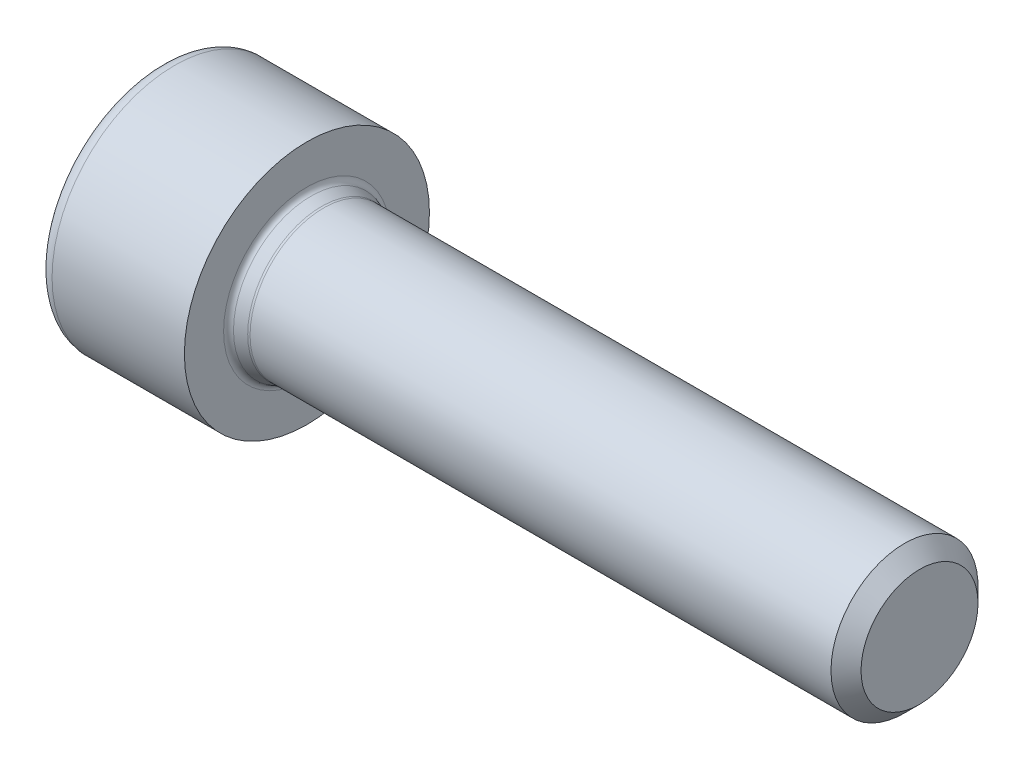
ISO-10303-21;
HEADER;
FILE_DESCRIPTION(('STEP AP214'),'2;1');
FILE_NAME('part.step','',(''),(''),'','','');
FILE_SCHEMA(('AUTOMOTIVE_DESIGN { 1 0 10303 214 1 1 1 1 }'));
ENDSEC;
DATA;
#1=APPLICATION_CONTEXT('core data for automotive mechanical design processes');
#2=APPLICATION_PROTOCOL_DEFINITION('international standard','automotive_design',2000,#1);
#3=PRODUCT_CONTEXT('',#1,'mechanical');
#4=PRODUCT('Part','Part','',(#3));
#5=PRODUCT_RELATED_PRODUCT_CATEGORY('part','',(#4));
#6=PRODUCT_DEFINITION_FORMATION('','',#4);
#7=PRODUCT_DEFINITION_CONTEXT('part definition',#1,'design');
#8=PRODUCT_DEFINITION('design','',#6,#7);
#9=PRODUCT_DEFINITION_SHAPE('','',#8);
#10=(LENGTH_UNIT() NAMED_UNIT(*) SI_UNIT(.MILLI.,.METRE.));
#11=(NAMED_UNIT(*) PLANE_ANGLE_UNIT() SI_UNIT($,.RADIAN.));
#12=(NAMED_UNIT(*) SI_UNIT($,.STERADIAN.) SOLID_ANGLE_UNIT());
#13=UNCERTAINTY_MEASURE_WITH_UNIT(LENGTH_MEASURE(1.E-05),#10,'distance_accuracy_value','');
#14=(GEOMETRIC_REPRESENTATION_CONTEXT(3) GLOBAL_UNCERTAINTY_ASSIGNED_CONTEXT((#13)) GLOBAL_UNIT_ASSIGNED_CONTEXT((#10,
#11,#12)) REPRESENTATION_CONTEXT('',''));
#15=CARTESIAN_POINT('',(0.,0.,0.));
#16=DIRECTION('',(0.,0.,1.));
#17=DIRECTION('',(1.,0.,0.));
#18=AXIS2_PLACEMENT_3D('',#15,#16,#17);
#19=CARTESIAN_POINT('',(-2.30000000004252,0.,0.));
#20=DIRECTION('',(-1.,0.,0.));
#21=DIRECTION('',(0.,0.,1.));
#22=AXIS2_PLACEMENT_3D('',#19,#20,#21);
#23=PLANE('',#22);
#24=DIRECTION('',(0.,0.500000000000001,-0.866025403784438));
#25=VECTOR('',#24,1.);
#26=CARTESIAN_POINT('',(-2.30000000004252,1.44337567297406,2.5));
#27=LINE('',#26,#25);
#28=CARTESIAN_POINT('',(-2.30000000004252,1.44337567297406,2.5));
#29=VERTEX_POINT('',#28);
#30=CARTESIAN_POINT('',(-2.29999999993848,2.16506350946109,1.25));
#31=VERTEX_POINT('',#30);
#32=EDGE_CURVE('E767',#29,#31,#27,.T.);
#33=ORIENTED_EDGE('',*,*,#32,.T.);
#34=CARTESIAN_POINT('',(-2.29999999993848,0.,0.));
#35=DIRECTION('',(1.,0.,0.));
#36=DIRECTION('',(0.,1.,0.));
#37=AXIS2_PLACEMENT_3D('',#34,#35,#36);
#38=CIRCLE('',#37,2.49999999997125);
#39=CARTESIAN_POINT('',(-2.29999999993848,0.,2.49999999997125));
#40=VERTEX_POINT('',#39);
#41=EDGE_CURVE('E61',#31,#40,#38,.T.);
#42=ORIENTED_EDGE('',*,*,#41,.T.);
#43=DIRECTION('',(0.,1.,0.));
#44=VECTOR('',#43,1.);
#45=CARTESIAN_POINT('',(-2.30000000004252,-1.44337567297406,2.5));
#46=LINE('',#45,#44);
#47=EDGE_CURVE('E762',#40,#29,#46,.T.);
#48=ORIENTED_EDGE('',*,*,#47,.T.);
#49=EDGE_LOOP('',(#33,#42,#48));
#50=FACE_BOUND('',#49,.T.);
#51=ADVANCED_FACE('F46',(#50),#23,.T.);
#52=CARTESIAN_POINT('',(-2.30000000004252,-1.44337567297406,2.5));
#53=VERTEX_POINT('',#52);
#54=EDGE_CURVE('E763',#53,#40,#46,.T.);
#55=ORIENTED_EDGE('',*,*,#54,.T.);
#56=CARTESIAN_POINT('',(-2.29999999993848,-2.1650635094362,1.24999999998563));
#57=VERTEX_POINT('',#56);
#58=EDGE_CURVE('E773',#40,#57,#38,.T.);
#59=ORIENTED_EDGE('',*,*,#58,.T.);
#60=DIRECTION('',(0.,0.500000000000001,0.866025403784438));
#61=VECTOR('',#60,1.);
#62=CARTESIAN_POINT('',(-2.30000000004252,-2.88675134594813,0.));
#63=LINE('',#62,#61);
#64=EDGE_CURVE('E760',#57,#53,#63,.T.);
#65=ORIENTED_EDGE('',*,*,#64,.T.);
#66=EDGE_LOOP('',(#55,#59,#65));
#67=FACE_BOUND('',#66,.T.);
#68=ADVANCED_FACE('F171',(#67),#23,.T.);
#69=CARTESIAN_POINT('',(-2.30000000004252,-2.88675134594813,0.));
#70=VERTEX_POINT('',#69);
#71=EDGE_CURVE('E717',#70,#57,#63,.T.);
#72=ORIENTED_EDGE('',*,*,#71,.T.);
#73=CARTESIAN_POINT('',(-2.29999999993848,-2.1650635094362,-1.24999999998563));
#74=VERTEX_POINT('',#73);
#75=EDGE_CURVE('E771',#57,#74,#38,.T.);
#76=ORIENTED_EDGE('',*,*,#75,.T.);
#77=DIRECTION('',(0.,-0.500000000000001,0.866025403784438));
#78=VECTOR('',#77,1.);
#79=CARTESIAN_POINT('',(-2.30000000004252,-1.44337567297406,-2.5));
#80=LINE('',#79,#78);
#81=EDGE_CURVE('E754',#74,#70,#80,.T.);
#82=ORIENTED_EDGE('',*,*,#81,.T.);
#83=EDGE_LOOP('',(#72,#76,#82));
#84=FACE_BOUND('',#83,.T.);
#85=ADVANCED_FACE('F178',(#84),#23,.T.);
#86=CARTESIAN_POINT('',(-2.30000000004252,-1.44337567297406,-2.5));
#87=VERTEX_POINT('',#86);
#88=EDGE_CURVE('E756',#87,#74,#80,.T.);
#89=ORIENTED_EDGE('',*,*,#88,.T.);
#90=CARTESIAN_POINT('',(-2.29999999993848,0.,-2.49999999997125));
#91=VERTEX_POINT('',#90);
#92=EDGE_CURVE('E770',#74,#91,#38,.T.);
#93=ORIENTED_EDGE('',*,*,#92,.T.);
#94=DIRECTION('',(0.,-1.,0.));
#95=VECTOR('',#94,1.);
#96=CARTESIAN_POINT('',(-2.30000000004252,1.44337567297406,-2.5));
#97=LINE('',#96,#95);
#98=EDGE_CURVE('E752',#91,#87,#97,.T.);
#99=ORIENTED_EDGE('',*,*,#98,.T.);
#100=EDGE_LOOP('',(#89,#93,#99));
#101=FACE_BOUND('',#100,.T.);
#102=ADVANCED_FACE('F198',(#101),#23,.T.);
#103=CARTESIAN_POINT('',(-2.30000000004252,1.44337567297406,-2.5));
#104=VERTEX_POINT('',#103);
#105=EDGE_CURVE('E751',#104,#91,#97,.T.);
#106=ORIENTED_EDGE('',*,*,#105,.T.);
#107=CARTESIAN_POINT('',(-2.29999999993848,2.1650635094362,-1.24999999998563));
#108=VERTEX_POINT('',#107);
#109=EDGE_CURVE('E369',#91,#108,#38,.T.);
#110=ORIENTED_EDGE('',*,*,#109,.T.);
#111=DIRECTION('',(0.,-0.500000000000001,-0.866025403784438));
#112=VECTOR('',#111,1.);
#113=CARTESIAN_POINT('',(-2.30000000004252,2.88675134594813,0.));
#114=LINE('',#113,#112);
#115=EDGE_CURVE('E768',#108,#104,#114,.T.);
#116=ORIENTED_EDGE('',*,*,#115,.T.);
#117=EDGE_LOOP('',(#106,#110,#116));
#118=FACE_BOUND('',#117,.T.);
#119=ADVANCED_FACE('F187',(#118),#23,.T.);
#120=CARTESIAN_POINT('',(-5.99999999985812,0.,0.));
#121=DIRECTION('',(-1.,0.,0.));
#122=DIRECTION('',(0.,0.,1.));
#123=AXIS2_PLACEMENT_3D('',#120,#121,#122);
#124=CONICAL_SURFACE('',#123,2.85999999994146,0.785398163397448);
#125=CARTESIAN_POINT('',(-5.99999999993489,1.47051329527011,2.45299625935565));
#126=CARTESIAN_POINT('',(-5.95337985864396,1.51854153544407,2.36980890719608));
#127=CARTESIAN_POINT('',(-5.9096230847942,1.5673565362491,2.2852588456384));
#128=CARTESIAN_POINT('',(-5.82973273982956,1.66680438442006,2.11301011990891));
#129=CARTESIAN_POINT('',(-5.7936401184895,1.71744538504198,2.02529733388339));
#130=CARTESIAN_POINT('',(-5.73195704732242,1.8195403237718,1.84846371280614));
#131=CARTESIAN_POINT('',(-5.70622146798667,1.87097172156668,1.75938191872169));
#132=CARTESIAN_POINT('',(-5.66672018678685,1.97488912039072,1.57939170416847));
#133=CARTESIAN_POINT('',(-5.65292769382286,2.02737248936692,1.48848784254915));
#134=CARTESIAN_POINT('',(-5.64046600076459,2.11915140336929,1.32952210043348));
#135=CARTESIAN_POINT('',(-5.63880919111971,2.15834914689821,1.26162961709934));
#136=CARTESIAN_POINT('',(-5.64287458244251,2.23666348103319,1.12598521141666));
#137=CARTESIAN_POINT('',(-5.6485992715918,2.27578003982059,1.05823334417962));
#138=CARTESIAN_POINT('',(-5.66710024406287,2.35362512366227,0.923401703846374));
#139=CARTESIAN_POINT('',(-5.67988333887047,2.39235323704564,0.85632264378508));
#140=CARTESIAN_POINT('',(-5.71180599701865,2.46913238667539,0.723337255664416));
#141=CARTESIAN_POINT('',(-5.7309450063552,2.50718348162865,0.657430825921753));
#142=CARTESIAN_POINT('',(-5.78439002123617,2.59911165021462,0.498206567284087));
#143=CARTESIAN_POINT('',(-5.82166158438957,2.65255835050399,0.405634166885996));
#144=CARTESIAN_POINT('',(-5.88410692314187,2.73128771509576,0.269270907365435));
#145=CARTESIAN_POINT('',(-5.90597424165388,2.75725306490608,0.224297602257664));
#146=CARTESIAN_POINT('',(-5.95161971173003,2.80874958669869,0.135103010099784));
#147=CARTESIAN_POINT('',(-5.97539713757238,2.83428091915521,0.0908814451001582));
#148=CARTESIAN_POINT('',(-5.99999999992756,2.85961372363973,0.047003740634759));
#149=B_SPLINE_CURVE_WITH_KNOTS('',3,(#125,#126,#127,#128,#129,#130,#131,#132,#133,#134,#135,
#136,#137,#138,#139,#140,#141,#142,#143,#144,#145,#146,#147,#148),.UNSPECIFIED.,.F.,.F.,(4,2,2,
2,2,2,2,2,2,2,2,4),(0.,0.320519784372311,0.64271126799229,0.960216099089799,1.2770068346069,
1.51191177225173,1.74689591318393,1.98210721527106,2.21729802088661,2.55633268454588,
2.72534661926588,2.89429664020024),.UNSPECIFIED.);
#150=CARTESIAN_POINT('',(-6.,1.47051329529543,2.4529962593428));
#151=VERTEX_POINT('',#150);
#152=CARTESIAN_POINT('',(-6.,2.85961372367054,0.0470037405814023));
#153=VERTEX_POINT('',#152);
#154=EDGE_CURVE('E311',#151,#153,#149,.T.);
#155=ORIENTED_EDGE('',*,*,#154,.F.);
#156=CARTESIAN_POINT('',(-5.99999999991496,0.,0.));
#157=DIRECTION('',(-1.,0.,0.));
#158=DIRECTION('',(0.,0.,1.));
#159=AXIS2_PLACEMENT_3D('',#156,#157,#158);
#160=CIRCLE('',#159,2.85999999999831);
#161=EDGE_CURVE('E250',#151,#153,#160,.T.);
#162=ORIENTED_EDGE('',*,*,#161,.T.);
#163=EDGE_LOOP('',(#155,#162));
#164=FACE_BOUND('',#163,.T.);
#165=ADVANCED_FACE('F197',(#164),#124,.F.);
#166=CARTESIAN_POINT('',(-5.99999999985812,0.,0.));
#167=DIRECTION('',(-1.,0.,0.));
#168=DIRECTION('',(0.,0.,1.));
#169=AXIS2_PLACEMENT_3D('',#166,#167,#168);
#170=CONICAL_SURFACE('',#169,2.85999999994146,0.785398163397448);
#171=CARTESIAN_POINT('',(-5.99999999993488,2.85961372362525,-0.0470037406288559));
#172=CARTESIAN_POINT('',(-5.95337985864396,2.81158548346847,-0.130191092798349));
#173=CARTESIAN_POINT('',(-5.9096230847942,2.7627704826705,-0.214741154360104));
#174=CARTESIAN_POINT('',(-5.82973273982955,2.66332263450474,-0.386989880092592));
#175=CARTESIAN_POINT('',(-5.7936401184895,2.6126816338809,-0.474702666117003));
#176=CARTESIAN_POINT('',(-5.73195704732241,2.51058669514971,-0.651536287193465));
#177=CARTESIAN_POINT('',(-5.70622146798666,2.45915529735533,-0.740618081278201));
#178=CARTESIAN_POINT('',(-5.66672018678685,2.35523789853165,-0.920608295831632));
#179=CARTESIAN_POINT('',(-5.65292769382285,2.30275452955531,-1.01151215745087));
#180=CARTESIAN_POINT('',(-5.64046600076459,2.21097561555288,-1.1704778995665));
#181=CARTESIAN_POINT('',(-5.6388091911197,2.17177787202397,-1.23837038290065));
#182=CARTESIAN_POINT('',(-5.6428745824425,2.09346353788901,-1.37401478858334));
#183=CARTESIAN_POINT('',(-5.64859927159179,2.0543469791016,-1.44176665582038));
#184=CARTESIAN_POINT('',(-5.66710024406286,1.97650189525992,-1.57659829615362));
#185=CARTESIAN_POINT('',(-5.67988333887046,1.93777378187655,-1.64367735621491));
#186=CARTESIAN_POINT('',(-5.71180599701864,1.8609946322468,-1.77666274433558));
#187=CARTESIAN_POINT('',(-5.7309450063552,1.82294353729354,-1.84256917407824));
#188=CARTESIAN_POINT('',(-5.78439002123617,1.73101536870757,-2.00179343271591));
#189=CARTESIAN_POINT('',(-5.82166158438957,1.6775686684182,-2.094365833114));
#190=CARTESIAN_POINT('',(-5.88410692314187,1.59883930382643,-2.23072909263456));
#191=CARTESIAN_POINT('',(-5.90597424165387,1.57287395401611,-2.27570239774233));
#192=CARTESIAN_POINT('',(-5.95161971173002,1.5213774322235,-2.36489698990021));
#193=CARTESIAN_POINT('',(-5.97539713757237,1.49584609976698,-2.40911855489984));
#194=CARTESIAN_POINT('',(-5.99999999992755,1.47051329528246,-2.45299625936524));
#195=B_SPLINE_CURVE_WITH_KNOTS('',3,(#171,#172,#173,#174,#175,#176,#177,#178,#179,#180,#181,
#182,#183,#184,#185,#186,#187,#188,#189,#190,#191,#192,#193,#194),.UNSPECIFIED.,.F.,.F.,(4,2,2,
2,2,2,2,2,2,2,2,4),(0.,0.320519784372311,0.642711267992291,0.9602160990898,1.2770068346069,
1.51191177225173,1.74689591318393,1.98210721527106,2.21729802088661,2.55633268454588,
2.72534661926588,2.89429664020025),.UNSPECIFIED.);
#196=CARTESIAN_POINT('',(-6.,2.85961372362677,-0.047003740657203));
#197=VERTEX_POINT('',#196);
#198=CARTESIAN_POINT('',(-6.,1.47051329525165,-2.4529962594186));
#199=VERTEX_POINT('',#198);
#200=EDGE_CURVE('E303',#197,#199,#195,.T.);
#201=ORIENTED_EDGE('',*,*,#200,.F.);
#202=CARTESIAN_POINT('',(-5.99999999991496,0.,0.));
#203=DIRECTION('',(-1.,0.,0.));
#204=DIRECTION('',(0.,0.,1.));
#205=AXIS2_PLACEMENT_3D('',#202,#203,#204);
#206=CIRCLE('',#205,2.85999999999831);
#207=EDGE_CURVE('E469',#197,#199,#206,.T.);
#208=ORIENTED_EDGE('',*,*,#207,.T.);
#209=EDGE_LOOP('',(#201,#208));
#210=FACE_BOUND('',#209,.T.);
#211=ADVANCED_FACE('F205',(#210),#170,.F.);
#212=CARTESIAN_POINT('',(-5.99999999985812,0.,0.));
#213=DIRECTION('',(-1.,0.,0.));
#214=DIRECTION('',(0.,0.,1.));
#215=AXIS2_PLACEMENT_3D('',#212,#213,#214);
#216=CONICAL_SURFACE('',#215,2.85999999994146,0.785398163475904);
#217=CARTESIAN_POINT('',(-5.99999999993489,1.38910042835514,-2.49999999998451));
#218=CARTESIAN_POINT('',(-5.95337985864481,1.2930439480111,-2.49999999999443));
#219=CARTESIAN_POINT('',(-5.90962308479644,1.19541394639471,-2.4999999999985));
#220=CARTESIAN_POINT('',(-5.82973273983604,0.996518250031227,-2.5000000000015));
#221=CARTESIAN_POINT('',(-5.79364011849883,0.895236248772081,-2.5000000000004));
#222=CARTESIAN_POINT('',(-5.7319570473392,0.69104637128496,-2.49999999999961));
#223=CARTESIAN_POINT('',(-5.70622146800801,0.588183575682958,-2.4999999999999));
#224=CARTESIAN_POINT('',(-5.66672018681897,0.380348778010364,-2.5000000000001));
#225=CARTESIAN_POINT('',(-5.65292769386117,0.275382040045695,-2.50000000000002));
#226=CARTESIAN_POINT('',(-5.64046600081421,0.0918242120126986,-2.49999999999998));
#227=CARTESIAN_POINT('',(-5.63880919117488,0.0134287249385632,-2.5));
#228=CARTESIAN_POINT('',(-5.64287458251059,-0.143199943363373,-2.5));
#229=CARTESIAN_POINT('',(-5.64859927166723,-0.221433060953873,-2.5));
#230=CARTESIAN_POINT('',(-5.66710024415429,-0.377123228667899,-2.5));
#231=CARTESIAN_POINT('',(-5.67988333897053,-0.454579455449625,-2.5));
#232=CARTESIAN_POINT('',(-5.71180599713676,-0.608137754738414,-2.5));
#233=CARTESIAN_POINT('',(-5.73094500648272,-0.684239944659232,-2.5));
#234=CARTESIAN_POINT('',(-5.78439002136351,-0.868096281784494,-2.5));
#235=CARTESIAN_POINT('',(-5.82166158449898,-0.974989682304416,-2.5));
#236=CARTESIAN_POINT('',(-5.88410692321585,-1.13244841140338,-2.5));
#237=CARTESIAN_POINT('',(-5.90597424171462,-1.18437911099638,-2.5));
#238=CARTESIAN_POINT('',(-5.95161971176199,-1.28737215452755,-2.5));
#239=CARTESIAN_POINT('',(-5.97539713758882,-1.33843481941416,-2.5));
#240=CARTESIAN_POINT('',(-5.99999999992755,-1.38910042835727,-2.5));
#241=B_SPLINE_CURVE_WITH_KNOTS('',3,(#217,#218,#219,#220,#221,#222,#223,#224,#225,#226,#227,
#228,#229,#230,#231,#232,#233,#234,#235,#236,#237,#238,#239,#240),.UNSPECIFIED.,.F.,.F.,(4,2,2,
2,2,2,2,2,2,2,2,4),(0.,0.32051978440716,0.642711268062002,0.960216099193144,1.27700683474385,
1.5119117724371,1.7468959134178,1.98210721555345,2.21729802121749,2.55633268469378,
2.725346619322,2.89429664016489),.UNSPECIFIED.);
#242=CARTESIAN_POINT('',(-6.,1.38910042833134,-2.5));
#243=VERTEX_POINT('',#242);
#244=CARTESIAN_POINT('',(-6.,-1.38910042841888,-2.5));
#245=VERTEX_POINT('',#244);
#246=EDGE_CURVE('E281',#243,#245,#241,.T.);
#247=ORIENTED_EDGE('',*,*,#246,.F.);
#248=CARTESIAN_POINT('',(-5.99999999991496,0.,0.));
#249=DIRECTION('',(-1.,0.,0.));
#250=DIRECTION('',(0.,0.,1.));
#251=AXIS2_PLACEMENT_3D('',#248,#249,#250);
#252=CIRCLE('',#251,2.85999999999831);
#253=EDGE_CURVE('E474',#243,#245,#252,.T.);
#254=ORIENTED_EDGE('',*,*,#253,.T.);
#255=EDGE_LOOP('',(#247,#254));
#256=FACE_BOUND('',#255,.T.);
#257=ADVANCED_FACE('F295',(#256),#216,.F.);
#258=CARTESIAN_POINT('',(-5.99999999985812,0.,0.));
#259=DIRECTION('',(-1.,0.,0.));
#260=DIRECTION('',(0.,0.,1.));
#261=AXIS2_PLACEMENT_3D('',#258,#259,#260);
#262=CONICAL_SURFACE('',#261,2.85999999994146,0.785398163397448);
#263=CARTESIAN_POINT('',(-5.99999999993489,-1.47051329527011,-2.45299625935565));
#264=CARTESIAN_POINT('',(-5.95337985864396,-1.51854153544407,-2.36980890719608));
#265=CARTESIAN_POINT('',(-5.9096230847942,-1.5673565362491,-2.2852588456384));
#266=CARTESIAN_POINT('',(-5.82973273982956,-1.66680438442006,-2.11301011990891));
#267=CARTESIAN_POINT('',(-5.7936401184895,-1.71744538504198,-2.02529733388339));
#268=CARTESIAN_POINT('',(-5.73195704732242,-1.8195403237718,-1.84846371280614));
#269=CARTESIAN_POINT('',(-5.70622146798667,-1.87097172156668,-1.75938191872169));
#270=CARTESIAN_POINT('',(-5.66672018678685,-1.97488912039072,-1.57939170416847));
#271=CARTESIAN_POINT('',(-5.65292769382286,-2.02737248936692,-1.48848784254915));
#272=CARTESIAN_POINT('',(-5.64046600076459,-2.11915140336929,-1.32952210043348));
#273=CARTESIAN_POINT('',(-5.63880919111971,-2.15834914689821,-1.26162961709934));
#274=CARTESIAN_POINT('',(-5.64287458244251,-2.23666348103319,-1.12598521141666));
#275=CARTESIAN_POINT('',(-5.6485992715918,-2.27578003982059,-1.05823334417962));
#276=CARTESIAN_POINT('',(-5.66710024406287,-2.35362512366227,-0.923401703846373));
#277=CARTESIAN_POINT('',(-5.67988333887047,-2.39235323704564,-0.856322643785079));
#278=CARTESIAN_POINT('',(-5.71180599701865,-2.46913238667539,-0.723337255664416));
#279=CARTESIAN_POINT('',(-5.7309450063552,-2.50718348162865,-0.657430825921753));
#280=CARTESIAN_POINT('',(-5.78439002123617,-2.59911165021462,-0.498206567284087));
#281=CARTESIAN_POINT('',(-5.82166158438957,-2.65255835050399,-0.405634166885997));
#282=CARTESIAN_POINT('',(-5.88410692314187,-2.73128771509576,-0.269270907365435));
#283=CARTESIAN_POINT('',(-5.90597424165388,-2.75725306490608,-0.224297602257664));
#284=CARTESIAN_POINT('',(-5.95161971173003,-2.80874958669869,-0.135103010099784));
#285=CARTESIAN_POINT('',(-5.97539713757238,-2.83428091915521,-0.0908814451001591));
#286=CARTESIAN_POINT('',(-5.99999999992756,-2.85961372363973,-0.0470037406347598));
#287=B_SPLINE_CURVE_WITH_KNOTS('',3,(#263,#264,#265,#266,#267,#268,#269,#270,#271,#272,#273,
#274,#275,#276,#277,#278,#279,#280,#281,#282,#283,#284,#285,#286),.UNSPECIFIED.,.F.,.F.,(4,2,2,
2,2,2,2,2,2,2,2,4),(0.,0.320519784372311,0.64271126799229,0.960216099089799,1.2770068346069,
1.51191177225173,1.74689591318393,1.98210721527106,2.21729802088661,2.55633268454588,
2.72534661926588,2.89429664020024),.UNSPECIFIED.);
#288=CARTESIAN_POINT('',(-6.,-1.47051329529543,-2.45299625934279));
#289=VERTEX_POINT('',#288);
#290=CARTESIAN_POINT('',(-6.,-2.85961372367054,-0.0470037405814006));
#291=VERTEX_POINT('',#290);
#292=EDGE_CURVE('E273',#289,#291,#287,.T.);
#293=ORIENTED_EDGE('',*,*,#292,.F.);
#294=CARTESIAN_POINT('',(-5.99999999991496,0.,0.));
#295=DIRECTION('',(-1.,0.,0.));
#296=DIRECTION('',(0.,0.,1.));
#297=AXIS2_PLACEMENT_3D('',#294,#295,#296);
#298=CIRCLE('',#297,2.85999999999831);
#299=EDGE_CURVE('E485',#289,#291,#298,.T.);
#300=ORIENTED_EDGE('',*,*,#299,.T.);
#301=EDGE_LOOP('',(#293,#300));
#302=FACE_BOUND('',#301,.T.);
#303=ADVANCED_FACE('F292',(#302),#262,.F.);
#304=CARTESIAN_POINT('',(-5.99999999985812,0.,0.));
#305=DIRECTION('',(-1.,0.,0.));
#306=DIRECTION('',(0.,0.,1.));
#307=AXIS2_PLACEMENT_3D('',#304,#305,#306);
#308=CONICAL_SURFACE('',#307,2.85999999994146,0.785398163397448);
#309=CARTESIAN_POINT('',(-5.99999999993488,-2.85961372362525,0.0470037406288566));
#310=CARTESIAN_POINT('',(-5.95337985864396,-2.81158548346847,0.130191092798349));
#311=CARTESIAN_POINT('',(-5.9096230847942,-2.7627704826705,0.214741154360105));
#312=CARTESIAN_POINT('',(-5.82973273982955,-2.66332263450474,0.386989880092593));
#313=CARTESIAN_POINT('',(-5.7936401184895,-2.6126816338809,0.474702666117003));
#314=CARTESIAN_POINT('',(-5.73195704732241,-2.51058669514971,0.651536287193466));
#315=CARTESIAN_POINT('',(-5.70622146798666,-2.45915529735533,0.740618081278202));
#316=CARTESIAN_POINT('',(-5.66672018678685,-2.35523789853165,0.920608295831633));
#317=CARTESIAN_POINT('',(-5.65292769382285,-2.30275452955531,1.01151215745087));
#318=CARTESIAN_POINT('',(-5.64046600076459,-2.21097561555288,1.1704778995665));
#319=CARTESIAN_POINT('',(-5.6388091911197,-2.17177787202397,1.23837038290065));
#320=CARTESIAN_POINT('',(-5.6428745824425,-2.09346353788901,1.37401478858335));
#321=CARTESIAN_POINT('',(-5.64859927159179,-2.0543469791016,1.44176665582038));
#322=CARTESIAN_POINT('',(-5.66710024406286,-1.97650189525992,1.57659829615362));
#323=CARTESIAN_POINT('',(-5.67988333887046,-1.93777378187655,1.64367735621492));
#324=CARTESIAN_POINT('',(-5.71180599701864,-1.8609946322468,1.77666274433558));
#325=CARTESIAN_POINT('',(-5.73094500635519,-1.82294353729354,1.84256917407824));
#326=CARTESIAN_POINT('',(-5.78439002123616,-1.73101536870757,2.00179343271591));
#327=CARTESIAN_POINT('',(-5.82166158438957,-1.6775686684182,2.094365833114));
#328=CARTESIAN_POINT('',(-5.88410692314186,-1.59883930382643,2.23072909263456));
#329=CARTESIAN_POINT('',(-5.90597424165387,-1.57287395401611,2.27570239774233));
#330=CARTESIAN_POINT('',(-5.95161971173002,-1.5213774322235,2.36489698990021));
#331=CARTESIAN_POINT('',(-5.97539713757237,-1.49584609976698,2.40911855489984));
#332=CARTESIAN_POINT('',(-5.99999999992755,-1.47051329528246,2.45299625936524));
#333=B_SPLINE_CURVE_WITH_KNOTS('',3,(#309,#310,#311,#312,#313,#314,#315,#316,#317,#318,#319,
#320,#321,#322,#323,#324,#325,#326,#327,#328,#329,#330,#331,#332),.UNSPECIFIED.,.F.,.F.,(4,2,2,
2,2,2,2,2,2,2,2,4),(0.,0.320519784372311,0.642711267992291,0.9602160990898,1.2770068346069,
1.51191177225173,1.74689591318393,1.98210721527106,2.21729802088661,2.55633268454588,
2.72534661926588,2.89429664020025),.UNSPECIFIED.);
#334=CARTESIAN_POINT('',(-6.,-2.85961372362677,0.047003740657219));
#335=VERTEX_POINT('',#334);
#336=CARTESIAN_POINT('',(-6.,-1.47051329525165,2.45299625941861));
#337=VERTEX_POINT('',#336);
#338=EDGE_CURVE('E251',#335,#337,#333,.T.);
#339=ORIENTED_EDGE('',*,*,#338,.F.);
#340=CARTESIAN_POINT('',(-5.99999999991496,0.,0.));
#341=DIRECTION('',(-1.,0.,0.));
#342=DIRECTION('',(0.,0.,1.));
#343=AXIS2_PLACEMENT_3D('',#340,#341,#342);
#344=CIRCLE('',#343,2.85999999999831);
#345=EDGE_CURVE('E372',#335,#337,#344,.T.);
#346=ORIENTED_EDGE('',*,*,#345,.T.);
#347=EDGE_LOOP('',(#339,#346));
#348=FACE_BOUND('',#347,.T.);
#349=ADVANCED_FACE('F235',(#348),#308,.F.);
#350=CARTESIAN_POINT('',(-5.99999999985812,0.,0.));
#351=DIRECTION('',(-1.,0.,0.));
#352=DIRECTION('',(0.,0.,1.));
#353=AXIS2_PLACEMENT_3D('',#350,#351,#352);
#354=CONICAL_SURFACE('',#353,2.85999999994146,0.785398163475919);
#355=CARTESIAN_POINT('',(-5.99999999993489,-1.38910042835514,2.49999999998451));
#356=CARTESIAN_POINT('',(-5.9533798586448,-1.2930439480111,2.49999999999443));
#357=CARTESIAN_POINT('',(-5.90962308479644,-1.1954139463947,2.4999999999985));
#358=CARTESIAN_POINT('',(-5.82973273983604,-0.996518250031217,2.5000000000015));
#359=CARTESIAN_POINT('',(-5.79364011849883,-0.895236248772068,2.5000000000004));
#360=CARTESIAN_POINT('',(-5.73195704733921,-0.691046371284942,2.49999999999961));
#361=CARTESIAN_POINT('',(-5.70622146800802,-0.588183575682938,2.4999999999999));
#362=CARTESIAN_POINT('',(-5.66672018681897,-0.380348778010339,2.5000000000001));
#363=CARTESIAN_POINT('',(-5.65292769386118,-0.275382040045668,2.50000000000002));
#364=CARTESIAN_POINT('',(-5.64046600081422,-0.091824212012666,2.49999999999998));
#365=CARTESIAN_POINT('',(-5.63880919117489,-0.0134287249385275,2.5));
#366=CARTESIAN_POINT('',(-5.6428745825106,0.143199943363415,2.5));
#367=CARTESIAN_POINT('',(-5.64859927166724,0.221433060953918,2.5));
#368=CARTESIAN_POINT('',(-5.66710024415431,0.37712322866795,2.5));
#369=CARTESIAN_POINT('',(-5.67988333897055,0.454579455449678,2.5));
#370=CARTESIAN_POINT('',(-5.71180599713678,0.608137754738473,2.5));
#371=CARTESIAN_POINT('',(-5.73094500648275,0.684239944659293,2.5));
#372=CARTESIAN_POINT('',(-5.78439002136354,0.868096281784547,2.5));
#373=CARTESIAN_POINT('',(-5.821661584499,0.974989682304458,2.5));
#374=CARTESIAN_POINT('',(-5.88410692321587,1.1324484114034,2.5));
#375=CARTESIAN_POINT('',(-5.90597424171463,1.1843791109964,2.5));
#376=CARTESIAN_POINT('',(-5.951619711762,1.28737215452756,2.5));
#377=CARTESIAN_POINT('',(-5.97539713758882,1.33843481941416,2.5));
#378=CARTESIAN_POINT('',(-5.99999999992755,1.38910042835727,2.5));
#379=B_SPLINE_CURVE_WITH_KNOTS('',3,(#355,#356,#357,#358,#359,#360,#361,#362,#363,#364,#365,
#366,#367,#368,#369,#370,#371,#372,#373,#374,#375,#376,#377,#378),.UNSPECIFIED.,.F.,.F.,(4,2,2,
2,2,2,2,2,2,2,2,4),(0.,0.320519784407167,0.642711268062016,0.960216099193164,1.27700683474388,
1.51191177243714,1.74689591341784,1.9821072155535,2.21729802121755,2.55633268469381,
2.72534661932201,2.89429664016488),.UNSPECIFIED.);
#380=CARTESIAN_POINT('',(-6.,-1.38910042841889,2.5));
#381=VERTEX_POINT('',#380);
#382=CARTESIAN_POINT('',(-6.,1.38910042841889,2.5));
#383=VERTEX_POINT('',#382);
#384=EDGE_CURVE('E240',#381,#383,#379,.T.);
#385=ORIENTED_EDGE('',*,*,#384,.F.);
#386=CARTESIAN_POINT('',(-5.99999999991496,0.,0.));
#387=DIRECTION('',(-1.,0.,0.));
#388=DIRECTION('',(0.,0.,1.));
#389=AXIS2_PLACEMENT_3D('',#386,#387,#388);
#390=CIRCLE('',#389,2.85999999999831);
#391=EDGE_CURVE('E363',#381,#383,#390,.T.);
#392=ORIENTED_EDGE('',*,*,#391,.T.);
#393=EDGE_LOOP('',(#385,#392));
#394=FACE_BOUND('',#393,.T.);
#395=ADVANCED_FACE('F230',(#394),#354,.F.);
#396=CARTESIAN_POINT('',(-6.,0.,-2.86000000000001));
#397=DIRECTION('',(1.,0.,0.));
#398=DIRECTION('',(0.,0.,-1.));
#399=AXIS2_PLACEMENT_3D('',#396,#397,#398);
#400=PLANE('',#399);
#401=CARTESIAN_POINT('',(-6.,0.,0.));
#402=DIRECTION('',(1.,0.,0.));
#403=DIRECTION('',(0.,0.,-1.));
#404=AXIS2_PLACEMENT_3D('',#401,#402,#403);
#405=CIRCLE('',#404,4.4);
#406=CARTESIAN_POINT('',(-6.,0.,-4.4));
#407=VERTEX_POINT('',#406);
#408=EDGE_CURVE('E13',#407,#407,#405,.F.);
#409=ORIENTED_EDGE('',*,*,#408,.T.);
#410=EDGE_LOOP('',(#409));
#411=FACE_BOUND('',#410,.T.);
#412=ORIENTED_EDGE('',*,*,#253,.F.);
#413=DIRECTION('',(0.,-1.,0.));
#414=VECTOR('',#413,1.);
#415=CARTESIAN_POINT('',(-6.,0.,-2.5));
#416=LINE('',#415,#414);
#417=CARTESIAN_POINT('',(-6.,1.44337567297406,-2.5));
#418=VERTEX_POINT('',#417);
#419=EDGE_CURVE('E683',#418,#243,#416,.T.);
#420=ORIENTED_EDGE('',*,*,#419,.F.);
#421=DIRECTION('',(0.,-0.5,-0.866025403784439));
#422=VECTOR('',#421,1.);
#423=CARTESIAN_POINT('',(-6.,2.16506350946109,-1.25));
#424=LINE('',#423,#422);
#425=EDGE_CURVE('E689',#199,#418,#424,.T.);
#426=ORIENTED_EDGE('',*,*,#425,.F.);
#427=ORIENTED_EDGE('',*,*,#207,.F.);
#428=CARTESIAN_POINT('',(-6.,2.88675134594813,0.));
#429=VERTEX_POINT('',#428);
#430=EDGE_CURVE('E687',#429,#197,#424,.T.);
#431=ORIENTED_EDGE('',*,*,#430,.F.);
#432=DIRECTION('',(0.,0.499999999999999,-0.866025403784439));
#433=VECTOR('',#432,1.);
#434=CARTESIAN_POINT('',(-6.,2.16506350946109,1.25000000000001));
#435=LINE('',#434,#433);
#436=EDGE_CURVE('E730',#153,#429,#435,.T.);
#437=ORIENTED_EDGE('',*,*,#436,.F.);
#438=ORIENTED_EDGE('',*,*,#161,.F.);
#439=CARTESIAN_POINT('',(-6.,1.44337567297406,2.5));
#440=VERTEX_POINT('',#439);
#441=EDGE_CURVE('E731',#440,#151,#435,.T.);
#442=ORIENTED_EDGE('',*,*,#441,.F.);
#443=DIRECTION('',(0.,1.,0.));
#444=VECTOR('',#443,1.);
#445=CARTESIAN_POINT('',(-6.,0.,2.5));
#446=LINE('',#445,#444);
#447=EDGE_CURVE('E723',#383,#440,#446,.T.);
#448=ORIENTED_EDGE('',*,*,#447,.F.);
#449=ORIENTED_EDGE('',*,*,#391,.F.);
#450=CARTESIAN_POINT('',(-6.,-1.44337567297406,2.5));
#451=VERTEX_POINT('',#450);
#452=EDGE_CURVE('E726',#451,#381,#446,.T.);
#453=ORIENTED_EDGE('',*,*,#452,.F.);
#454=DIRECTION('',(0.,0.500000000000004,0.866025403784436));
#455=VECTOR('',#454,1.);
#456=CARTESIAN_POINT('',(-6.,-2.1650635094611,1.25));
#457=LINE('',#456,#455);
#458=EDGE_CURVE('E724',#337,#451,#457,.T.);
#459=ORIENTED_EDGE('',*,*,#458,.F.);
#460=ORIENTED_EDGE('',*,*,#345,.F.);
#461=CARTESIAN_POINT('',(-6.,-2.88675134594813,0.));
#462=VERTEX_POINT('',#461);
#463=EDGE_CURVE('E713',#462,#335,#457,.T.);
#464=ORIENTED_EDGE('',*,*,#463,.F.);
#465=DIRECTION('',(0.,-0.499999999999998,0.866025403784439));
#466=VECTOR('',#465,1.);
#467=CARTESIAN_POINT('',(-6.,-2.16506350946109,-1.25000000000001));
#468=LINE('',#467,#466);
#469=EDGE_CURVE('E721',#291,#462,#468,.T.);
#470=ORIENTED_EDGE('',*,*,#469,.F.);
#471=ORIENTED_EDGE('',*,*,#299,.F.);
#472=CARTESIAN_POINT('',(-6.,-1.44337567297407,-2.5));
#473=VERTEX_POINT('',#472);
#474=EDGE_CURVE('E686',#473,#289,#468,.T.);
#475=ORIENTED_EDGE('',*,*,#474,.F.);
#476=EDGE_CURVE('E685',#245,#473,#416,.T.);
#477=ORIENTED_EDGE('',*,*,#476,.F.);
#478=EDGE_LOOP('',(#412,#420,#426,#427,#431,#437,#438,#442,#448,#449,#453,#459,#460,#464,#470,
#471,#475,#477));
#479=FACE_BOUND('',#478,.T.);
#480=ADVANCED_FACE('F221',(#411,#479),#400,.F.);
#481=CARTESIAN_POINT('',(25.,0.,0.));
#482=DIRECTION('',(1.,0.,0.));
#483=DIRECTION('',(0.,0.,-1.));
#484=AXIS2_PLACEMENT_3D('',#481,#482,#483);
#485=CYLINDRICAL_SURFACE('',#484,5.);
#486=CARTESIAN_POINT('',(-5.4,0.,0.));
#487=DIRECTION('',(1.,0.,0.));
#488=DIRECTION('',(0.,0.,-1.));
#489=AXIS2_PLACEMENT_3D('',#486,#487,#488);
#490=CIRCLE('',#489,5.);
#491=CARTESIAN_POINT('',(-5.4,0.,-5.));
#492=VERTEX_POINT('',#491);
#493=EDGE_CURVE('E54',#492,#492,#490,.T.);
#494=ORIENTED_EDGE('',*,*,#493,.T.);
#495=EDGE_LOOP('',(#494));
#496=FACE_BOUND('',#495,.T.);
#497=CARTESIAN_POINT('',(0.,0.,0.));
#498=DIRECTION('',(1.,0.,0.));
#499=DIRECTION('',(0.,0.,-1.));
#500=AXIS2_PLACEMENT_3D('',#497,#498,#499);
#501=CIRCLE('',#500,5.);
#502=CARTESIAN_POINT('',(0.,0.,-5.));
#503=VERTEX_POINT('',#502);
#504=EDGE_CURVE('E360',#503,#503,#501,.F.);
#505=ORIENTED_EDGE('',*,*,#504,.T.);
#506=EDGE_LOOP('',(#505));
#507=FACE_BOUND('',#506,.T.);
#508=ADVANCED_FACE('F212',(#496,#507),#485,.T.);
#509=CARTESIAN_POINT('',(0.,0.,-5.));
#510=DIRECTION('',(-1.,0.,0.));
#511=DIRECTION('',(0.,0.,1.));
#512=AXIS2_PLACEMENT_3D('',#509,#510,#511);
#513=PLANE('',#512);
#514=CARTESIAN_POINT('',(0.,0.,0.));
#515=DIRECTION('',(-1.,0.,0.));
#516=DIRECTION('',(0.,0.,1.));
#517=AXIS2_PLACEMENT_3D('',#514,#515,#516);
#518=CIRCLE('',#517,3.39999999995586);
#519=CARTESIAN_POINT('',(0.,0.,3.39999999995586));
#520=VERTEX_POINT('',#519);
#521=EDGE_CURVE('E339',#520,#520,#518,.T.);
#522=ORIENTED_EDGE('',*,*,#521,.T.);
#523=EDGE_LOOP('',(#522));
#524=FACE_BOUND('',#523,.T.);
#525=ORIENTED_EDGE('',*,*,#504,.F.);
#526=EDGE_LOOP('',(#525));
#527=FACE_BOUND('',#526,.T.);
#528=ADVANCED_FACE('F200',(#524,#527),#513,.F.);
#529=CARTESIAN_POINT('',(-5.64000417413523,0.,-2.5));
#530=DIRECTION('',(0.,0.,-1.));
#531=DIRECTION('',(0.,1.,0.));
#532=AXIS2_PLACEMENT_3D('',#529,#530,#531);
#533=PLANE('',#532);
#534=ORIENTED_EDGE('',*,*,#476,.T.);
#535=DIRECTION('',(-1.,0.,0.));
#536=VECTOR('',#535,1.);
#537=CARTESIAN_POINT('',(-5.64000417413523,-1.44337567297406,-2.5));
#538=LINE('',#537,#536);
#539=EDGE_CURVE('E69',#87,#473,#538,.T.);
#540=ORIENTED_EDGE('',*,*,#539,.F.);
#541=ORIENTED_EDGE('',*,*,#98,.F.);
#542=ORIENTED_EDGE('',*,*,#105,.F.);
#543=DIRECTION('',(-1.,0.,0.));
#544=VECTOR('',#543,1.);
#545=CARTESIAN_POINT('',(-5.64000417413523,1.44337567297406,-2.5));
#546=LINE('',#545,#544);
#547=EDGE_CURVE('E694',#104,#418,#546,.T.);
#548=ORIENTED_EDGE('',*,*,#547,.T.);
#549=ORIENTED_EDGE('',*,*,#419,.T.);
#550=ORIENTED_EDGE('',*,*,#246,.T.);
#551=EDGE_LOOP('',(#534,#540,#541,#542,#548,#549,#550));
#552=FACE_BOUND('',#551,.T.);
#553=ADVANCED_FACE('F208',(#552),#533,.F.);
#554=CARTESIAN_POINT('',(-5.64000417413523,2.16506350946109,-1.25));
#555=DIRECTION('',(0.,0.866025403784439,-0.5));
#556=DIRECTION('',(0.,0.5,0.866025403784439));
#557=AXIS2_PLACEMENT_3D('',#554,#555,#556);
#558=PLANE('',#557);
#559=ORIENTED_EDGE('',*,*,#425,.T.);
#560=ORIENTED_EDGE('',*,*,#547,.F.);
#561=ORIENTED_EDGE('',*,*,#115,.F.);
#562=CARTESIAN_POINT('',(-2.30000000004252,2.88675134594813,0.));
#563=VERTEX_POINT('',#562);
#564=EDGE_CURVE('E746',#563,#108,#114,.T.);
#565=ORIENTED_EDGE('',*,*,#564,.F.);
#566=DIRECTION('',(-1.,0.,0.));
#567=VECTOR('',#566,1.);
#568=CARTESIAN_POINT('',(-5.64000417413523,2.88675134594813,0.));
#569=LINE('',#568,#567);
#570=EDGE_CURVE('E697',#563,#429,#569,.T.);
#571=ORIENTED_EDGE('',*,*,#570,.T.);
#572=ORIENTED_EDGE('',*,*,#430,.T.);
#573=ORIENTED_EDGE('',*,*,#200,.T.);
#574=EDGE_LOOP('',(#559,#560,#561,#565,#571,#572,#573));
#575=FACE_BOUND('',#574,.T.);
#576=ADVANCED_FACE('F219',(#575),#558,.F.);
#577=CARTESIAN_POINT('',(-5.64000417413523,2.16506350946109,1.25000000000001));
#578=DIRECTION('',(0.,0.866025403784439,0.499999999999999));
#579=DIRECTION('',(0.,-0.499999999999999,0.866025403784439));
#580=AXIS2_PLACEMENT_3D('',#577,#578,#579);
#581=PLANE('',#580);
#582=ORIENTED_EDGE('',*,*,#436,.T.);
#583=ORIENTED_EDGE('',*,*,#570,.F.);
#584=EDGE_CURVE('E766',#31,#563,#27,.T.);
#585=ORIENTED_EDGE('',*,*,#584,.F.);
#586=ORIENTED_EDGE('',*,*,#32,.F.);
#587=DIRECTION('',(-1.,0.,0.));
#588=VECTOR('',#587,1.);
#589=CARTESIAN_POINT('',(-5.64000417413523,1.44337567297406,2.5));
#590=LINE('',#589,#588);
#591=EDGE_CURVE('E700',#29,#440,#590,.T.);
#592=ORIENTED_EDGE('',*,*,#591,.T.);
#593=ORIENTED_EDGE('',*,*,#441,.T.);
#594=ORIENTED_EDGE('',*,*,#154,.T.);
#595=EDGE_LOOP('',(#582,#583,#585,#586,#592,#593,#594));
#596=FACE_BOUND('',#595,.T.);
#597=ADVANCED_FACE('F737',(#596),#581,.F.);
#598=CARTESIAN_POINT('',(-5.64000417413523,0.,2.5));
#599=DIRECTION('',(0.,0.,1.));
#600=DIRECTION('',(0.,-1.,0.));
#601=AXIS2_PLACEMENT_3D('',#598,#599,#600);
#602=PLANE('',#601);
#603=ORIENTED_EDGE('',*,*,#447,.T.);
#604=ORIENTED_EDGE('',*,*,#591,.F.);
#605=ORIENTED_EDGE('',*,*,#47,.F.);
#606=ORIENTED_EDGE('',*,*,#54,.F.);
#607=DIRECTION('',(-1.,0.,0.));
#608=VECTOR('',#607,1.);
#609=CARTESIAN_POINT('',(-5.64000417413523,-1.44337567297406,2.5));
#610=LINE('',#609,#608);
#611=EDGE_CURVE('E702',#53,#451,#610,.T.);
#612=ORIENTED_EDGE('',*,*,#611,.T.);
#613=ORIENTED_EDGE('',*,*,#452,.T.);
#614=ORIENTED_EDGE('',*,*,#384,.T.);
#615=EDGE_LOOP('',(#603,#604,#605,#606,#612,#613,#614));
#616=FACE_BOUND('',#615,.T.);
#617=ADVANCED_FACE('F781',(#616),#602,.F.);
#618=CARTESIAN_POINT('',(-5.64000417413523,-2.1650635094611,1.25));
#619=DIRECTION('',(0.,-0.866025403784436,0.500000000000004));
#620=DIRECTION('',(0.,-0.500000000000004,-0.866025403784436));
#621=AXIS2_PLACEMENT_3D('',#618,#619,#620);
#622=PLANE('',#621);
#623=ORIENTED_EDGE('',*,*,#458,.T.);
#624=ORIENTED_EDGE('',*,*,#611,.F.);
#625=ORIENTED_EDGE('',*,*,#64,.F.);
#626=ORIENTED_EDGE('',*,*,#71,.F.);
#627=DIRECTION('',(-1.,0.,0.));
#628=VECTOR('',#627,1.);
#629=CARTESIAN_POINT('',(-5.64000417413523,-2.88675134594813,0.));
#630=LINE('',#629,#628);
#631=EDGE_CURVE('E376',#70,#462,#630,.T.);
#632=ORIENTED_EDGE('',*,*,#631,.T.);
#633=ORIENTED_EDGE('',*,*,#463,.T.);
#634=ORIENTED_EDGE('',*,*,#338,.T.);
#635=EDGE_LOOP('',(#623,#624,#625,#626,#632,#633,#634));
#636=FACE_BOUND('',#635,.T.);
#637=ADVANCED_FACE('F193',(#636),#622,.F.);
#638=CARTESIAN_POINT('',(-5.64000417413523,-2.16506350946109,-1.25000000000001));
#639=DIRECTION('',(0.,-0.866025403784439,-0.499999999999998));
#640=DIRECTION('',(0.,0.499999999999999,-0.86602540378444));
#641=AXIS2_PLACEMENT_3D('',#638,#639,#640);
#642=PLANE('',#641);
#643=ORIENTED_EDGE('',*,*,#469,.T.);
#644=ORIENTED_EDGE('',*,*,#631,.F.);
#645=ORIENTED_EDGE('',*,*,#81,.F.);
#646=ORIENTED_EDGE('',*,*,#88,.F.);
#647=ORIENTED_EDGE('',*,*,#539,.T.);
#648=ORIENTED_EDGE('',*,*,#474,.T.);
#649=ORIENTED_EDGE('',*,*,#292,.T.);
#650=EDGE_LOOP('',(#643,#644,#645,#646,#647,#648,#649));
#651=FACE_BOUND('',#650,.T.);
#652=ADVANCED_FACE('F185',(#651),#642,.F.);
#653=ORIENTED_EDGE('',*,*,#564,.T.);
#654=EDGE_CURVE('E362',#108,#31,#38,.T.);
#655=ORIENTED_EDGE('',*,*,#654,.T.);
#656=ORIENTED_EDGE('',*,*,#584,.T.);
#657=EDGE_LOOP('',(#653,#655,#656));
#658=FACE_BOUND('',#657,.T.);
#659=ADVANCED_FACE('F174',(#658),#23,.T.);
#660=CARTESIAN_POINT('',(0.,0.,0.));
#661=DIRECTION('',(-1.,0.,0.));
#662=DIRECTION('',(0.,0.,-1.));
#663=AXIS2_PLACEMENT_3D('',#660,#661,#662);
#664=CONICAL_SURFACE('',#663,3.22243494095582,0.335638550294717);
#665=CARTESIAN_POINT('',(0.597656960847124,0.,0.));
#666=DIRECTION('',(-1.,0.,0.));
#667=DIRECTION('',(0.,0.,1.));
#668=AXIS2_PLACEMENT_3D('',#665,#666,#667);
#669=CIRCLE('',#668,3.01394995463585);
#670=CARTESIAN_POINT('',(0.597656960847124,0.,3.01394995463585));
#671=VERTEX_POINT('',#670);
#672=EDGE_CURVE('E344',#671,#671,#669,.T.);
#673=ORIENTED_EDGE('',*,*,#672,.T.);
#674=EDGE_LOOP('',(#673));
#675=FACE_BOUND('',#674,.T.);
#676=CARTESIAN_POINT('',(0.16765696092819,0.,0.));
#677=DIRECTION('',(-1.,0.,0.));
#678=DIRECTION('',(0.,0.,1.));
#679=AXIS2_PLACEMENT_3D('',#676,#677,#678);
#680=CIRCLE('',#679,3.1639499545917);
#681=CARTESIAN_POINT('',(0.16765696092819,0.,3.1639499545917));
#682=VERTEX_POINT('',#681);
#683=EDGE_CURVE('E342',#682,#682,#680,.F.);
#684=ORIENTED_EDGE('',*,*,#683,.T.);
#685=EDGE_LOOP('',(#684));
#686=FACE_BOUND('',#685,.T.);
#687=ADVANCED_FACE('F184',(#675,#686),#664,.T.);
#688=CARTESIAN_POINT('',(25.,0.,0.));
#689=DIRECTION('',(-1.,0.,0.));
#690=DIRECTION('',(0.,0.,1.));
#691=AXIS2_PLACEMENT_3D('',#688,#689,#690);
#692=CYLINDRICAL_SURFACE('',#691,3.);
#693=CARTESIAN_POINT('',(0.679999999918933,0.,0.));
#694=DIRECTION('',(1.,0.,0.));
#695=DIRECTION('',(0.,0.,-1.));
#696=AXIS2_PLACEMENT_3D('',#693,#694,#695);
#697=CIRCLE('',#696,3.);
#698=CARTESIAN_POINT('',(0.679999999918936,0.,3.));
#699=VERTEX_POINT('',#698);
#700=EDGE_CURVE('E345',#699,#699,#697,.T.);
#701=CARTESIAN_POINT('',(24.3865000000683,0.,0.));
#702=DIRECTION('',(1.,0.,0.));
#703=DIRECTION('',(0.,0.,-1.));
#704=AXIS2_PLACEMENT_3D('',#701,#702,#703);
#705=CIRCLE('',#704,3.);
#706=CARTESIAN_POINT('',(24.3865000000683,0.,3.));
#707=VERTEX_POINT('',#706);
#708=EDGE_CURVE('E350',#707,#707,#705,.F.);
#709=CARTESIAN_POINT('',(0.679999999918936,0.,3.));
#710=CARTESIAN_POINT('',(0.926942708253825,0.,3.));
#711=CARTESIAN_POINT('',(1.17388541658871,0.,3.));
#712=CARTESIAN_POINT('',(1.66777083325849,0.,3.));
#713=CARTESIAN_POINT('',(1.91471354159338,0.,3.));
#714=CARTESIAN_POINT('',(2.40859895826316,0.,3.));
#715=CARTESIAN_POINT('',(2.65554166659805,0.,3.));
#716=CARTESIAN_POINT('',(3.14942708326782,0.,3.));
#717=CARTESIAN_POINT('',(3.39636979160271,0.,3.));
#718=CARTESIAN_POINT('',(3.89025520827249,0.,3.));
#719=CARTESIAN_POINT('',(4.13719791660738,0.,3.));
#720=CARTESIAN_POINT('',(4.63108333327716,0.,3.));
#721=CARTESIAN_POINT('',(4.87802604161205,0.,3.));
#722=CARTESIAN_POINT('',(5.37191145828182,0.,3.));
#723=CARTESIAN_POINT('',(5.61885416661671,0.,3.));
#724=CARTESIAN_POINT('',(6.11273958328649,0.,3.));
#725=CARTESIAN_POINT('',(6.35968229162138,0.,3.));
#726=CARTESIAN_POINT('',(6.85356770829116,0.,3.));
#727=CARTESIAN_POINT('',(7.10051041662604,0.,3.));
#728=CARTESIAN_POINT('',(7.59439583329582,0.,3.));
#729=CARTESIAN_POINT('',(7.84133854163071,0.,3.));
#730=CARTESIAN_POINT('',(8.33522395830049,0.,3.));
#731=CARTESIAN_POINT('',(8.58216666663538,0.,3.));
#732=CARTESIAN_POINT('',(9.07605208330516,0.,3.));
#733=CARTESIAN_POINT('',(9.32299479164004,0.,3.));
#734=CARTESIAN_POINT('',(9.81688020830982,0.,3.));
#735=CARTESIAN_POINT('',(10.0638229166447,0.,3.));
#736=CARTESIAN_POINT('',(10.5577083333145,0.,3.));
#737=CARTESIAN_POINT('',(10.8046510416494,0.,3.));
#738=CARTESIAN_POINT('',(11.2985364583192,0.,3.));
#739=CARTESIAN_POINT('',(11.545479166654,0.,3.));
#740=CARTESIAN_POINT('',(12.0393645833238,0.,3.));
#741=CARTESIAN_POINT('',(12.2863072916587,0.,3.));
#742=CARTESIAN_POINT('',(12.7801927083285,0.,3.));
#743=CARTESIAN_POINT('',(13.0271354166634,0.,3.));
#744=CARTESIAN_POINT('',(13.5210208333332,0.,3.));
#745=CARTESIAN_POINT('',(13.767963541668,0.,3.));
#746=CARTESIAN_POINT('',(14.2618489583378,0.,3.));
#747=CARTESIAN_POINT('',(14.5087916666727,0.,3.));
#748=CARTESIAN_POINT('',(15.0026770833425,0.,3.));
#749=CARTESIAN_POINT('',(15.2496197916774,0.,3.));
#750=CARTESIAN_POINT('',(15.7435052083472,0.,3.));
#751=CARTESIAN_POINT('',(15.990447916682,0.,3.));
#752=CARTESIAN_POINT('',(16.4843333333518,0.,3.));
#753=CARTESIAN_POINT('',(16.7312760416867,0.,3.));
#754=CARTESIAN_POINT('',(17.2251614583565,0.,3.));
#755=CARTESIAN_POINT('',(17.4721041666914,0.,3.));
#756=CARTESIAN_POINT('',(17.9659895833612,0.,3.));
#757=CARTESIAN_POINT('',(18.212932291696,0.,3.));
#758=CARTESIAN_POINT('',(18.7068177083658,0.,3.));
#759=CARTESIAN_POINT('',(18.9537604167007,0.,3.));
#760=CARTESIAN_POINT('',(19.4476458333705,0.,3.));
#761=CARTESIAN_POINT('',(19.6945885417054,0.,3.));
#762=CARTESIAN_POINT('',(20.1884739583751,0.,3.));
#763=CARTESIAN_POINT('',(20.43541666671,0.,3.));
#764=CARTESIAN_POINT('',(20.9293020833798,0.,3.));
#765=CARTESIAN_POINT('',(21.1762447917147,0.,3.));
#766=CARTESIAN_POINT('',(21.6701302083845,0.,3.));
#767=CARTESIAN_POINT('',(21.9170729167194,0.,3.));
#768=CARTESIAN_POINT('',(22.4109583333891,0.,3.));
#769=CARTESIAN_POINT('',(22.657901041724,0.,3.));
#770=CARTESIAN_POINT('',(23.1517864583938,0.,3.));
#771=CARTESIAN_POINT('',(23.3987291667287,0.,3.));
#772=CARTESIAN_POINT('',(23.8926145833985,0.,3.));
#773=CARTESIAN_POINT('',(24.1395572917334,0.,3.));
#774=CARTESIAN_POINT('',(24.3865000000683,0.,3.));
#775=B_SPLINE_CURVE_WITH_KNOTS('',3,(#709,#710,#711,#712,#713,#714,#715,#716,#717,#718,#719,
#720,#721,#722,#723,#724,#725,#726,#727,#728,#729,#730,#731,#732,#733,#734,#735,#736,#737,#738,
#739,#740,#741,#742,#743,#744,#745,#746,#747,#748,#749,#750,#751,#752,#753,#754,#755,#756,#757,
#758,#759,#760,#761,#762,#763,#764,#765,#766,#767,#768,#769,#770,#771,#772,#773,#774),
.UNSPECIFIED.,.F.,.F.,(4,2,2,2,2,2,2,2,2,2,2,2,2,2,2,2,2,2,2,2,2,2,2,2,2,2,2,2,2,2,2,2,4),(0.,
0.740828125004665,1.48165625000933,2.222484375014,2.96331250001866,3.70414062502333,
4.444968750028,5.18579687503266,5.92662500003733,6.667453125042,7.40828125004666,
8.14910937505133,8.88993750005599,9.63076562506066,10.3715937500653,11.11242187507,
11.8532500000747,12.5940781250793,13.334906250084,14.0757343750887,14.8165625000933,
15.557390625098,16.2982187501027,17.0390468751073,17.779875000112,18.5207031251167,
19.2615312501213,20.002359375126,20.7431875001307,21.4840156251353,22.22484375014,
22.9656718751447,23.7065000001493),.UNSPECIFIED.);
#776=EDGE_CURVE('BSEAM167',#699,#707,#775,.T.);
#777=ORIENTED_EDGE('',*,*,#700,.T.);
#778=ORIENTED_EDGE('',*,*,#708,.T.);
#779=ORIENTED_EDGE('',*,*,#776,.T.);
#780=ORIENTED_EDGE('',*,*,#776,.F.);
#781=EDGE_LOOP('',(#777,#779,#778,#780));
#782=FACE_BOUND('',#781,.T.);
#783=ADVANCED_FACE('F167',(#782),#692,.T.);
#784=CARTESIAN_POINT('',(25.,0.,0.));
#785=DIRECTION('',(1.,0.,0.));
#786=DIRECTION('',(0.,0.,-1.));
#787=AXIS2_PLACEMENT_3D('',#784,#785,#786);
#788=PLANE('',#787);
#789=CARTESIAN_POINT('',(25.,0.,0.));
#790=DIRECTION('',(1.,0.,0.));
#791=DIRECTION('',(0.,0.,-1.));
#792=AXIS2_PLACEMENT_3D('',#789,#790,#791);
#793=CIRCLE('',#792,2.38650000001141);
#794=CARTESIAN_POINT('',(25.,0.,-2.38650000001141));
#795=VERTEX_POINT('',#794);
#796=EDGE_CURVE('E776',#795,#795,#793,.T.);
#797=ORIENTED_EDGE('',*,*,#796,.T.);
#798=EDGE_LOOP('',(#797));
#799=FACE_BOUND('',#798,.T.);
#800=ADVANCED_FACE('F158',(#799),#788,.T.);
#801=CARTESIAN_POINT('',(-0.856624326981014,0.,0.));
#802=DIRECTION('',(-1.,0.,0.));
#803=DIRECTION('',(0.,-1.,0.));
#804=AXIS2_PLACEMENT_3D('',#801,#802,#803);
#805=CONICAL_SURFACE('',#804,0.,1.0471975511966);
#806=ORIENTED_EDGE('',*,*,#41,.F.);
#807=ORIENTED_EDGE('',*,*,#654,.F.);
#808=ORIENTED_EDGE('',*,*,#109,.F.);
#809=ORIENTED_EDGE('',*,*,#92,.F.);
#810=ORIENTED_EDGE('',*,*,#75,.F.);
#811=ORIENTED_EDGE('',*,*,#58,.F.);
#812=EDGE_LOOP('',(#806,#807,#808,#809,#810,#811));
#813=FACE_BOUND('',#812,.T.);
#814=CARTESIAN_POINT('',(-0.856624326981014,0.,0.));
#815=VERTEX_POINT('',#814);
#816=VERTEX_LOOP('',#815);
#817=FACE_BOUND('',#816,.T.);
#818=ADVANCED_FACE('F155',(#813,#817),#805,.F.);
#819=CARTESIAN_POINT('',(25.,0.,0.));
#820=DIRECTION('',(-1.,0.,0.));
#821=DIRECTION('',(0.,0.,1.));
#822=AXIS2_PLACEMENT_3D('',#819,#820,#821);
#823=CONICAL_SURFACE('',#822,2.38650000001141,0.785398163443773);
#824=ORIENTED_EDGE('',*,*,#708,.F.);
#825=EDGE_LOOP('',(#824));
#826=FACE_BOUND('',#825,.T.);
#827=ORIENTED_EDGE('',*,*,#796,.F.);
#828=EDGE_LOOP('',(#827));
#829=FACE_BOUND('',#828,.T.);
#830=ADVANCED_FACE('F157',(#826,#829),#823,.T.);
#831=CARTESIAN_POINT('',(0.679999999918933,0.,0.));
#832=DIRECTION('',(1.,0.,0.));
#833=DIRECTION('',(0.,0.,-1.));
#834=AXIS2_PLACEMENT_3D('',#831,#832,#833);
#835=TOROIDAL_SURFACE('',#834,3.25,0.25);
#836=ORIENTED_EDGE('',*,*,#672,.F.);
#837=EDGE_LOOP('',(#836));
#838=FACE_BOUND('',#837,.T.);
#839=ORIENTED_EDGE('',*,*,#700,.F.);
#840=EDGE_LOOP('',(#839));
#841=FACE_BOUND('',#840,.T.);
#842=ADVANCED_FACE('F164',(#838,#841),#835,.F.);
#843=CARTESIAN_POINT('',(0.249999999999999,0.,0.));
#844=DIRECTION('',(-1.,0.,0.));
#845=DIRECTION('',(0.,0.,1.));
#846=AXIS2_PLACEMENT_3D('',#843,#844,#845);
#847=TOROIDAL_SURFACE('',#846,3.39999999995586,0.25);
#848=ORIENTED_EDGE('',*,*,#521,.F.);
#849=EDGE_LOOP('',(#848));
#850=FACE_BOUND('',#849,.T.);
#851=ORIENTED_EDGE('',*,*,#683,.F.);
#852=EDGE_LOOP('',(#851));
#853=FACE_BOUND('',#852,.T.);
#854=ADVANCED_FACE('F329',(#850,#853),#847,.F.);
#855=CARTESIAN_POINT('',(-5.4,0.,0.));
#856=DIRECTION('',(1.,0.,0.));
#857=DIRECTION('',(0.,0.,-1.));
#858=AXIS2_PLACEMENT_3D('',#855,#856,#857);
#859=TOROIDAL_SURFACE('',#858,4.4,0.599999999999997);
#860=ORIENTED_EDGE('',*,*,#408,.F.);
#861=EDGE_LOOP('',(#860));
#862=FACE_BOUND('',#861,.T.);
#863=ORIENTED_EDGE('',*,*,#493,.F.);
#864=EDGE_LOOP('',(#863));
#865=FACE_BOUND('',#864,.T.);
#866=ADVANCED_FACE('F48',(#862,#865),#859,.T.);
#867=CLOSED_SHELL('',(#51,#68,#85,#102,#119,#165,#211,#257,#303,#349,#395,#480,#508,#528,#553,
#576,#597,#617,#637,#652,#659,#687,#783,#800,#818,#830,#842,#854,#866));
#868=MANIFOLD_SOLID_BREP('B2',#867);
#869=ADVANCED_BREP_SHAPE_REPRESENTATION('',(#18,#868),#14);
#870=SHAPE_DEFINITION_REPRESENTATION(#9,#869);
ENDSEC;
END-ISO-10303-21;
